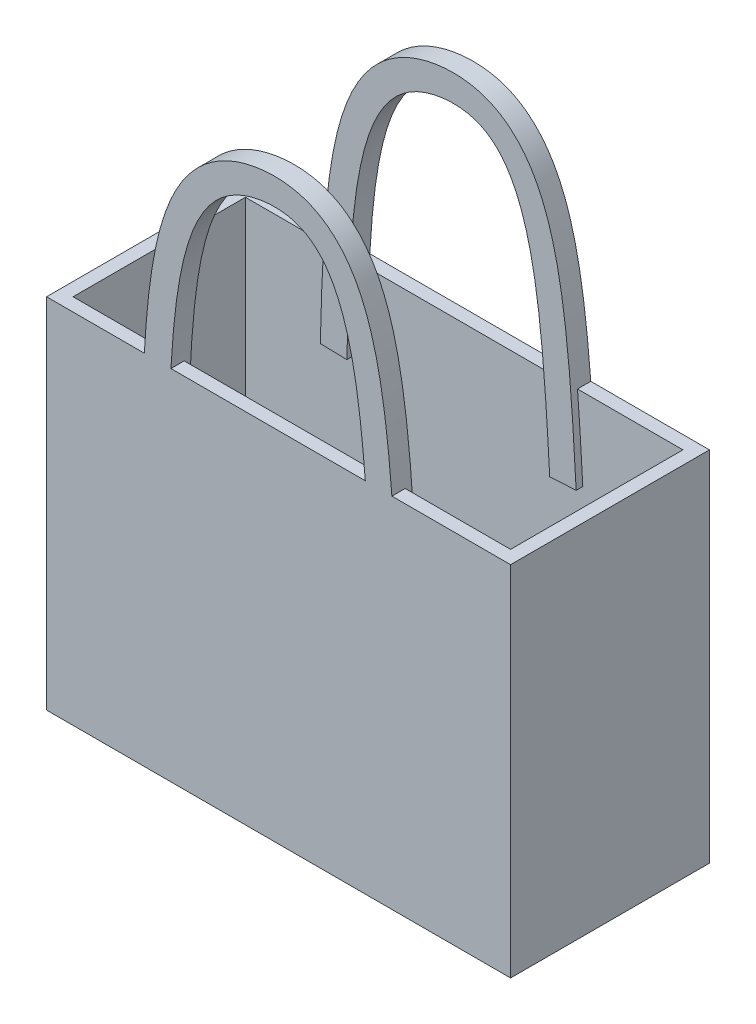
ISO-10303-21;
HEADER;
FILE_DESCRIPTION(('STEP AP214'),'2;1');
FILE_NAME('part.step','',(''),(''),'','','');
FILE_SCHEMA(('AUTOMOTIVE_DESIGN { 1 0 10303 214 1 1 1 1 }'));
ENDSEC;
DATA;
#1=APPLICATION_CONTEXT('core data for automotive mechanical design processes');
#2=APPLICATION_PROTOCOL_DEFINITION('international standard','automotive_design',2000,#1);
#3=PRODUCT_CONTEXT('',#1,'mechanical');
#4=PRODUCT('Part','Part','',(#3));
#5=PRODUCT_RELATED_PRODUCT_CATEGORY('part','',(#4));
#6=PRODUCT_DEFINITION_FORMATION('','',#4);
#7=PRODUCT_DEFINITION_CONTEXT('part definition',#1,'design');
#8=PRODUCT_DEFINITION('design','',#6,#7);
#9=PRODUCT_DEFINITION_SHAPE('','',#8);
#10=(LENGTH_UNIT() NAMED_UNIT(*) SI_UNIT(.MILLI.,.METRE.));
#11=(NAMED_UNIT(*) PLANE_ANGLE_UNIT() SI_UNIT($,.RADIAN.));
#12=(NAMED_UNIT(*) SI_UNIT($,.STERADIAN.) SOLID_ANGLE_UNIT());
#13=UNCERTAINTY_MEASURE_WITH_UNIT(LENGTH_MEASURE(1.E-05),#10,'distance_accuracy_value','');
#14=(GEOMETRIC_REPRESENTATION_CONTEXT(3) GLOBAL_UNCERTAINTY_ASSIGNED_CONTEXT((#13)) GLOBAL_UNIT_ASSIGNED_CONTEXT((#10,
#11,#12)) REPRESENTATION_CONTEXT('',''));
#15=CARTESIAN_POINT('',(0.,0.,0.));
#16=DIRECTION('',(0.,0.,1.));
#17=DIRECTION('',(1.,0.,0.));
#18=AXIS2_PLACEMENT_3D('',#15,#16,#17);
#19=CARTESIAN_POINT('',(0.,0.,150.));
#20=DIRECTION('',(0.,-1.,0.));
#21=DIRECTION('',(0.,0.,-1.));
#22=AXIS2_PLACEMENT_3D('',#19,#20,#21);
#23=PLANE('',#22);
#24=DIRECTION('',(0.,0.,-1.));
#25=VECTOR('',#24,1.);
#26=CARTESIAN_POINT('',(93.794809096541,0.,15.));
#27=LINE('',#26,#25);
#28=CARTESIAN_POINT('',(93.7948090965409,0.,10.));
#29=VERTEX_POINT('',#28);
#30=CARTESIAN_POINT('',(93.7948090965409,0.,0.));
#31=VERTEX_POINT('',#30);
#32=EDGE_CURVE('E285',#29,#31,#27,.T.);
#33=ORIENTED_EDGE('',*,*,#32,.F.);
#34=DIRECTION('',(-1.,0.,0.));
#35=VECTOR('',#34,1.);
#36=CARTESIAN_POINT('',(10.,0.,10.));
#37=LINE('',#36,#35);
#38=CARTESIAN_POINT('',(240.414570299536,0.,10.));
#39=VERTEX_POINT('',#38);
#40=EDGE_CURVE('E338',#39,#29,#37,.T.);
#41=ORIENTED_EDGE('',*,*,#40,.F.);
#42=DIRECTION('',(0.,0.,-1.));
#43=VECTOR('',#42,1.);
#44=CARTESIAN_POINT('',(240.414570299536,0.,15.));
#45=LINE('',#44,#43);
#46=CARTESIAN_POINT('',(240.414570299536,0.,0.));
#47=VERTEX_POINT('',#46);
#48=EDGE_CURVE('E444',#47,#39,#45,.F.);
#49=ORIENTED_EDGE('',*,*,#48,.F.);
#50=DIRECTION('',(-1.,0.,0.));
#51=VECTOR('',#50,1.);
#52=CARTESIAN_POINT('',(0.,0.,0.));
#53=LINE('',#52,#51);
#54=EDGE_CURVE('E65',#47,#31,#53,.T.);
#55=ORIENTED_EDGE('',*,*,#54,.T.);
#56=EDGE_LOOP('',(#33,#41,#49,#55));
#57=FACE_BOUND('',#56,.T.);
#58=ADVANCED_FACE('F41',(#57),#23,.F.);
#59=DIRECTION('',(0.,0.,-1.));
#60=VECTOR('',#59,1.);
#61=CARTESIAN_POINT('',(260.479594823145,0.,15.));
#62=LINE('',#61,#60);
#63=CARTESIAN_POINT('',(260.479594822731,5.16859818833204E-09,10.));
#64=VERTEX_POINT('',#63);
#65=CARTESIAN_POINT('',(260.479594822731,0.,0.));
#66=VERTEX_POINT('',#65);
#67=EDGE_CURVE('E442',#64,#66,#62,.T.);
#68=ORIENTED_EDGE('',*,*,#67,.F.);
#69=CARTESIAN_POINT('',(340.,0.,10.));
#70=VERTEX_POINT('',#69);
#71=EDGE_CURVE('E335',#70,#64,#37,.T.);
#72=ORIENTED_EDGE('',*,*,#71,.F.);
#73=DIRECTION('',(0.,0.,-1.));
#74=VECTOR('',#73,1.);
#75=CARTESIAN_POINT('',(340.,0.,10.));
#76=LINE('',#75,#74);
#77=CARTESIAN_POINT('',(340.,0.,140.));
#78=VERTEX_POINT('',#77);
#79=EDGE_CURVE('E318',#78,#70,#76,.T.);
#80=ORIENTED_EDGE('',*,*,#79,.F.);
#81=DIRECTION('',(1.,0.,0.));
#82=VECTOR('',#81,1.);
#83=CARTESIAN_POINT('',(10.,0.,140.));
#84=LINE('',#83,#82);
#85=CARTESIAN_POINT('',(260.479594822731,5.16859818833204E-09,140.));
#86=VERTEX_POINT('',#85);
#87=EDGE_CURVE('E341',#86,#78,#84,.T.);
#88=ORIENTED_EDGE('',*,*,#87,.F.);
#89=DIRECTION('',(0.,0.,1.));
#90=VECTOR('',#89,1.);
#91=CARTESIAN_POINT('',(260.479594823145,0.,135.));
#92=LINE('',#91,#90);
#93=CARTESIAN_POINT('',(260.479594822731,5.16843946113399E-09,150.));
#94=VERTEX_POINT('',#93);
#95=EDGE_CURVE('E309',#86,#94,#92,.T.);
#96=ORIENTED_EDGE('',*,*,#95,.T.);
#97=DIRECTION('',(-1.,0.,0.));
#98=VECTOR('',#97,1.);
#99=CARTESIAN_POINT('',(0.,0.,150.));
#100=LINE('',#99,#98);
#101=CARTESIAN_POINT('',(350.,0.,150.));
#102=VERTEX_POINT('',#101);
#103=EDGE_CURVE('E365',#102,#94,#100,.T.);
#104=ORIENTED_EDGE('',*,*,#103,.F.);
#105=DIRECTION('',(0.,0.,-1.));
#106=VECTOR('',#105,1.);
#107=CARTESIAN_POINT('',(350.,0.,150.));
#108=LINE('',#107,#106);
#109=CARTESIAN_POINT('',(350.,0.,0.));
#110=VERTEX_POINT('',#109);
#111=EDGE_CURVE('E380',#102,#110,#108,.T.);
#112=ORIENTED_EDGE('',*,*,#111,.T.);
#113=EDGE_CURVE('E360',#110,#66,#53,.T.);
#114=ORIENTED_EDGE('',*,*,#113,.T.);
#115=EDGE_LOOP('',(#68,#72,#80,#88,#96,#104,#112,#114));
#116=FACE_BOUND('',#115,.T.);
#117=ADVANCED_FACE('F489',(#116),#23,.F.);
#118=DIRECTION('',(0.,0.,-1.));
#119=VECTOR('',#118,1.);
#120=CARTESIAN_POINT('',(73.7625136466976,0.,15.));
#121=LINE('',#120,#119);
#122=CARTESIAN_POINT('',(73.7625136466978,0.,0.));
#123=VERTEX_POINT('',#122);
#124=CARTESIAN_POINT('',(73.7625136466978,0.,10.));
#125=VERTEX_POINT('',#124);
#126=EDGE_CURVE('E57',#123,#125,#121,.F.);
#127=ORIENTED_EDGE('',*,*,#126,.F.);
#128=CARTESIAN_POINT('',(0.,0.,0.));
#129=VERTEX_POINT('',#128);
#130=EDGE_CURVE('E376',#123,#129,#53,.T.);
#131=ORIENTED_EDGE('',*,*,#130,.T.);
#132=DIRECTION('',(0.,0.,-1.));
#133=VECTOR('',#132,1.);
#134=CARTESIAN_POINT('',(0.,0.,150.));
#135=LINE('',#134,#133);
#136=CARTESIAN_POINT('',(0.,0.,150.));
#137=VERTEX_POINT('',#136);
#138=EDGE_CURVE('E368',#137,#129,#135,.T.);
#139=ORIENTED_EDGE('',*,*,#138,.F.);
#140=CARTESIAN_POINT('',(73.7625136466978,3.05723328597463E-12,150.));
#141=VERTEX_POINT('',#140);
#142=EDGE_CURVE('E364',#141,#137,#100,.T.);
#143=ORIENTED_EDGE('',*,*,#142,.F.);
#144=DIRECTION('',(0.,0.,1.));
#145=VECTOR('',#144,1.);
#146=CARTESIAN_POINT('',(73.7625136466976,0.,135.));
#147=LINE('',#146,#145);
#148=CARTESIAN_POINT('',(73.7625136466978,3.05723328597463E-12,140.));
#149=VERTEX_POINT('',#148);
#150=EDGE_CURVE('E300',#141,#149,#147,.F.);
#151=ORIENTED_EDGE('',*,*,#150,.T.);
#152=CARTESIAN_POINT('',(10.,0.,140.));
#153=VERTEX_POINT('',#152);
#154=EDGE_CURVE('E323',#153,#149,#84,.T.);
#155=ORIENTED_EDGE('',*,*,#154,.F.);
#156=DIRECTION('',(0.,0.,1.));
#157=VECTOR('',#156,1.);
#158=CARTESIAN_POINT('',(10.,0.,10.));
#159=LINE('',#158,#157);
#160=CARTESIAN_POINT('',(10.,0.,10.));
#161=VERTEX_POINT('',#160);
#162=EDGE_CURVE('E337',#161,#153,#159,.T.);
#163=ORIENTED_EDGE('',*,*,#162,.F.);
#164=EDGE_CURVE('E334',#125,#161,#37,.T.);
#165=ORIENTED_EDGE('',*,*,#164,.F.);
#166=EDGE_LOOP('',(#127,#131,#139,#143,#151,#155,#163,#165));
#167=FACE_BOUND('',#166,.T.);
#168=ADVANCED_FACE('F474',(#167),#23,.F.);
#169=CARTESIAN_POINT('',(10.,-231.,10.));
#170=DIRECTION('',(0.,0.,-1.));
#171=DIRECTION('',(-1.,0.,0.));
#172=AXIS2_PLACEMENT_3D('',#169,#170,#171);
#173=PLANE('',#172);
#174=CARTESIAN_POINT('',(91.4929809096213,-62.8156278497075,10.));
#175=CARTESIAN_POINT('',(94.1433152416058,44.5229125956667,10.));
#176=CARTESIAN_POINT('',(99.6512458376963,140.581809831668,10.));
#177=CARTESIAN_POINT('',(229.93611277386,149.87502618412,10.));
#178=CARTESIAN_POINT('',(238.321506577675,48.0566833183809,10.));
#179=CARTESIAN_POINT('',(244.505619551194,-62.8156278497071,10.));
#180=B_SPLINE_CURVE_WITH_KNOTS('',3,(#174,#175,#176,#177,#178,#179),.UNSPECIFIED.,.F.,.F.,(4,1,
1,4),(0.,0.479711783292934,0.579711783292933,1.),.UNSPECIFIED.);
#181=CARTESIAN_POINT('',(244.505619551194,-62.8156278497071,10.));
#182=VERTEX_POINT('',#181);
#183=EDGE_CURVE('E11',#39,#182,#180,.T.);
#184=ORIENTED_EDGE('',*,*,#183,.F.);
#185=ORIENTED_EDGE('',*,*,#40,.T.);
#186=CARTESIAN_POINT('',(91.4929809096213,-62.8156278497071,10.));
#187=VERTEX_POINT('',#186);
#188=EDGE_CURVE('E50',#187,#29,#180,.T.);
#189=ORIENTED_EDGE('',*,*,#188,.F.);
#190=DIRECTION('',(0.999695307732111,-0.0246838347587989,0.));
#191=VECTOR('',#190,1.);
#192=CARTESIAN_POINT('',(14.1998233376946,-60.9071548232412,10.));
#193=LINE('',#192,#191);
#194=CARTESIAN_POINT('',(71.499074754979,-62.3219511545311,10.));
#195=VERTEX_POINT('',#194);
#196=EDGE_CURVE('E220',#195,#187,#193,.T.);
#197=ORIENTED_EDGE('',*,*,#196,.F.);
#198=CARTESIAN_POINT('',(264.474581336507,-61.7018212162633,10.));
#199=CARTESIAN_POINT('',(264.359861197015,-59.6450530010714,10.));
#200=CARTESIAN_POINT('',(264.1281711613,-55.5183281460358,10.));
#201=CARTESIAN_POINT('',(263.662584547036,-47.3715169307364,10.));
#202=CARTESIAN_POINT('',(263.068669824457,-37.3189162788222,10.));
#203=CARTESIAN_POINT('',(262.32607309182,-25.4989973807097,10.));
#204=CARTESIAN_POINT('',(261.279307032465,-10.0695009524096,10.));
#205=CARTESIAN_POINT('',(259.834076027679,8.56805980484624,10.));
#206=CARTESIAN_POINT('',(257.77886641607,29.8174841784501,10.));
#207=CARTESIAN_POINT('',(255.296076431386,49.8816023376985,10.));
#208=CARTESIAN_POINT('',(251.253957388999,74.9779877582421,10.));
#209=CARTESIAN_POINT('',(245.870456485047,97.5002400792132,10.));
#210=CARTESIAN_POINT('',(238.370187441123,117.374287672239,10.));
#211=CARTESIAN_POINT('',(231.363192359434,130.930109167378,10.));
#212=CARTESIAN_POINT('',(222.563205850644,142.999320369824,10.));
#213=CARTESIAN_POINT('',(211.52124285423,153.16424797389,10.));
#214=CARTESIAN_POINT('',(200.41860218203,159.355264747324,10.));
#215=CARTESIAN_POINT('',(190.636952866794,162.586657437858,10.));
#216=CARTESIAN_POINT('',(183.158869733971,164.088930655825,10.));
#217=CARTESIAN_POINT('',(175.715503482644,164.788484604246,10.));
#218=CARTESIAN_POINT('',(165.858150685831,164.786603224791,10.));
#219=CARTESIAN_POINT('',(153.792320603951,163.213522240861,10.));
#220=CARTESIAN_POINT('',(140.018348362321,159.056690804969,10.));
#221=CARTESIAN_POINT('',(127.488531798112,152.64833779447,10.));
#222=CARTESIAN_POINT('',(116.504391157525,144.203146271106,10.));
#223=CARTESIAN_POINT('',(104.117409689732,130.714428633952,10.));
#224=CARTESIAN_POINT('',(92.7078956653951,110.654723234851,10.));
#225=CARTESIAN_POINT('',(83.7589594824481,82.8739265829659,10.));
#226=CARTESIAN_POINT('',(78.991737002638,56.781257619985,10.));
#227=CARTESIAN_POINT('',(76.3073193709062,34.202145736461,10.));
#228=CARTESIAN_POINT('',(74.7610979260472,16.4395281432733,10.));
#229=CARTESIAN_POINT('',(73.5900141298827,-2.1217321966958,10.));
#230=CARTESIAN_POINT('',(72.8556330828585,-18.2249979813567,10.));
#231=CARTESIAN_POINT('',(72.3721091210352,-31.4691073144518,10.));
#232=CARTESIAN_POINT('',(72.0515239720081,-41.576380623869,10.));
#233=CARTESIAN_POINT('',(71.8110855051603,-50.1432771889315,10.));
#234=CARTESIAN_POINT('',(71.6300816115548,-57.0720872412288,10.));
#235=CARTESIAN_POINT('',(71.5422043248216,-60.5752035759095,10.));
#236=CARTESIAN_POINT('',(71.499074754979,-62.3219511545311,10.));
#237=B_SPLINE_CURVE_WITH_KNOTS('',3,(#198,#199,#200,#201,#202,#203,#204,#205,#206,#207,#208,
#209,#210,#211,#212,#213,#214,#215,#216,#217,#218,#219,#220,#221,#222,#223,#224,#225,#226,#227,
#228,#229,#230,#231,#232,#233,#234,#235,#236),.UNSPECIFIED.,.F.,.F.,(4,1,1,1,1,1,1,1,1,1,1,1,1,
1,1,1,1,1,1,1,1,1,1,1,1,1,1,1,1,1,1,1,1,1,1,1,4),(0.,0.0078125,0.015625,0.03125,0.046875,0.0625,
0.09375,0.125,0.15625,0.1875,0.25,0.28125,0.3125,0.34375,0.375,0.40625,0.421875,0.4375,0.453125,
0.46875,0.5,0.53125,0.5625,0.59375,0.625,0.6875,0.75,0.8125,0.84375,0.875,0.90625,0.9375,
0.953125,0.96875,0.984375,0.9921875,1.),.UNSPECIFIED.);
#238=EDGE_CURVE('E414',#125,#195,#237,.T.);
#239=ORIENTED_EDGE('',*,*,#238,.F.);
#240=ORIENTED_EDGE('',*,*,#164,.T.);
#241=DIRECTION('',(0.,1.,0.));
#242=VECTOR('',#241,1.);
#243=CARTESIAN_POINT('',(10.,-231.,10.));
#244=LINE('',#243,#242);
#245=CARTESIAN_POINT('',(10.,-231.,10.));
#246=VERTEX_POINT('',#245);
#247=EDGE_CURVE('E351',#246,#161,#244,.T.);
#248=ORIENTED_EDGE('',*,*,#247,.F.);
#249=DIRECTION('',(-1.,0.,0.));
#250=VECTOR('',#249,1.);
#251=CARTESIAN_POINT('',(10.,-231.,10.));
#252=LINE('',#251,#250);
#253=CARTESIAN_POINT('',(340.,-231.,10.));
#254=VERTEX_POINT('',#253);
#255=EDGE_CURVE('E322',#254,#246,#252,.T.);
#256=ORIENTED_EDGE('',*,*,#255,.F.);
#257=DIRECTION('',(0.,1.,0.));
#258=VECTOR('',#257,1.);
#259=CARTESIAN_POINT('',(340.,-231.,10.));
#260=LINE('',#259,#258);
#261=EDGE_CURVE('E332',#254,#70,#260,.T.);
#262=ORIENTED_EDGE('',*,*,#261,.T.);
#263=ORIENTED_EDGE('',*,*,#71,.T.);
#264=CARTESIAN_POINT('',(264.474581336507,-61.7018212162633,10.));
#265=VERTEX_POINT('',#264);
#266=EDGE_CURVE('E418',#265,#64,#237,.T.);
#267=ORIENTED_EDGE('',*,*,#266,.F.);
#268=DIRECTION('',(0.998448089265657,0.0556903316721882,0.));
#269=VECTOR('',#268,1.);
#270=CARTESIAN_POINT('',(1.37559089349026,-76.3766653047185,10.));
#271=LINE('',#270,#269);
#272=EDGE_CURVE('E45',#182,#265,#271,.T.);
#273=ORIENTED_EDGE('',*,*,#272,.F.);
#274=EDGE_LOOP('',(#184,#185,#189,#197,#239,#240,#248,#256,#262,#263,#267,#273));
#275=FACE_BOUND('',#274,.T.);
#276=ADVANCED_FACE('F470',(#275),#173,.F.);
#277=CARTESIAN_POINT('',(93.7948090965409,-1.64278313175004E-12,140.));
#278=VERTEX_POINT('',#277);
#279=CARTESIAN_POINT('',(240.414570299536,-2.85188539450587E-12,140.));
#280=VERTEX_POINT('',#279);
#281=EDGE_CURVE('E344',#278,#280,#84,.T.);
#282=ORIENTED_EDGE('',*,*,#281,.F.);
#283=DIRECTION('',(0.,0.,1.));
#284=VECTOR('',#283,1.);
#285=CARTESIAN_POINT('',(93.794809096541,0.,135.));
#286=LINE('',#285,#284);
#287=CARTESIAN_POINT('',(93.7948090965409,-1.70002900645727E-12,150.));
#288=VERTEX_POINT('',#287);
#289=EDGE_CURVE('E315',#278,#288,#286,.T.);
#290=ORIENTED_EDGE('',*,*,#289,.T.);
#291=CARTESIAN_POINT('',(240.414570299536,-3.45903861109775E-12,150.));
#292=VERTEX_POINT('',#291);
#293=EDGE_CURVE('E369',#292,#288,#100,.T.);
#294=ORIENTED_EDGE('',*,*,#293,.F.);
#295=DIRECTION('',(0.,0.,1.));
#296=VECTOR('',#295,1.);
#297=CARTESIAN_POINT('',(240.414570299536,0.,135.));
#298=LINE('',#297,#296);
#299=EDGE_CURVE('E312',#292,#280,#298,.F.);
#300=ORIENTED_EDGE('',*,*,#299,.T.);
#301=EDGE_LOOP('',(#282,#290,#294,#300));
#302=FACE_BOUND('',#301,.T.);
#303=ADVANCED_FACE('F473',(#302),#23,.F.);
#304=CARTESIAN_POINT('',(0.,0.,150.));
#305=DIRECTION('',(1.,0.,0.));
#306=DIRECTION('',(0.,1.,0.));
#307=AXIS2_PLACEMENT_3D('',#304,#305,#306);
#308=PLANE('',#307);
#309=DIRECTION('',(0.,-1.,0.));
#310=VECTOR('',#309,1.);
#311=CARTESIAN_POINT('',(0.,0.,0.));
#312=LINE('',#311,#310);
#313=CARTESIAN_POINT('',(0.,-270.,0.));
#314=VERTEX_POINT('',#313);
#315=EDGE_CURVE('E348',#129,#314,#312,.T.);
#316=ORIENTED_EDGE('',*,*,#315,.T.);
#317=DIRECTION('',(0.,0.,-1.));
#318=VECTOR('',#317,1.);
#319=CARTESIAN_POINT('',(0.,-270.,150.));
#320=LINE('',#319,#318);
#321=CARTESIAN_POINT('',(0.,-270.,150.));
#322=VERTEX_POINT('',#321);
#323=EDGE_CURVE('E386',#322,#314,#320,.T.);
#324=ORIENTED_EDGE('',*,*,#323,.F.);
#325=DIRECTION('',(0.,-1.,0.));
#326=VECTOR('',#325,1.);
#327=CARTESIAN_POINT('',(0.,0.,150.));
#328=LINE('',#327,#326);
#329=EDGE_CURVE('E356',#137,#322,#328,.T.);
#330=ORIENTED_EDGE('',*,*,#329,.F.);
#331=ORIENTED_EDGE('',*,*,#138,.T.);
#332=EDGE_LOOP('',(#316,#324,#330,#331));
#333=FACE_BOUND('',#332,.T.);
#334=ADVANCED_FACE('F43',(#333),#308,.F.);
#335=CARTESIAN_POINT('',(0.,-270.,150.));
#336=DIRECTION('',(0.,1.,0.));
#337=DIRECTION('',(0.,0.,1.));
#338=AXIS2_PLACEMENT_3D('',#335,#336,#337);
#339=PLANE('',#338);
#340=DIRECTION('',(1.,0.,0.));
#341=VECTOR('',#340,1.);
#342=CARTESIAN_POINT('',(0.,-270.,0.));
#343=LINE('',#342,#341);
#344=CARTESIAN_POINT('',(350.,-270.,0.));
#345=VERTEX_POINT('',#344);
#346=EDGE_CURVE('E372',#314,#345,#343,.T.);
#347=ORIENTED_EDGE('',*,*,#346,.T.);
#348=DIRECTION('',(0.,0.,-1.));
#349=VECTOR('',#348,1.);
#350=CARTESIAN_POINT('',(350.,-270.,150.));
#351=LINE('',#350,#349);
#352=CARTESIAN_POINT('',(350.,-270.,150.));
#353=VERTEX_POINT('',#352);
#354=EDGE_CURVE('E383',#353,#345,#351,.T.);
#355=ORIENTED_EDGE('',*,*,#354,.F.);
#356=DIRECTION('',(1.,0.,0.));
#357=VECTOR('',#356,1.);
#358=CARTESIAN_POINT('',(0.,-270.,150.));
#359=LINE('',#358,#357);
#360=EDGE_CURVE('E359',#322,#353,#359,.T.);
#361=ORIENTED_EDGE('',*,*,#360,.F.);
#362=ORIENTED_EDGE('',*,*,#323,.T.);
#363=EDGE_LOOP('',(#347,#355,#361,#362));
#364=FACE_BOUND('',#363,.T.);
#365=ADVANCED_FACE('F491',(#364),#339,.F.);
#366=CARTESIAN_POINT('',(350.,0.,150.));
#367=DIRECTION('',(-1.,0.,0.));
#368=DIRECTION('',(0.,-1.,0.));
#369=AXIS2_PLACEMENT_3D('',#366,#367,#368);
#370=PLANE('',#369);
#371=DIRECTION('',(0.,1.,0.));
#372=VECTOR('',#371,1.);
#373=CARTESIAN_POINT('',(350.,0.,0.));
#374=LINE('',#373,#372);
#375=EDGE_CURVE('E374',#345,#110,#374,.T.);
#376=ORIENTED_EDGE('',*,*,#375,.T.);
#377=ORIENTED_EDGE('',*,*,#111,.F.);
#378=DIRECTION('',(0.,1.,0.));
#379=VECTOR('',#378,1.);
#380=CARTESIAN_POINT('',(350.,0.,150.));
#381=LINE('',#380,#379);
#382=EDGE_CURVE('E362',#353,#102,#381,.T.);
#383=ORIENTED_EDGE('',*,*,#382,.F.);
#384=ORIENTED_EDGE('',*,*,#354,.T.);
#385=EDGE_LOOP('',(#376,#377,#383,#384));
#386=FACE_BOUND('',#385,.T.);
#387=ADVANCED_FACE('F482',(#386),#370,.F.);
#388=CARTESIAN_POINT('',(0.,0.,150.));
#389=DIRECTION('',(0.,0.,1.));
#390=DIRECTION('',(1.,0.,0.));
#391=AXIS2_PLACEMENT_3D('',#388,#389,#390);
#392=PLANE('',#391);
#393=CARTESIAN_POINT('',(264.474581336507,-61.7018212162633,150.));
#394=CARTESIAN_POINT('',(264.359861197015,-59.6450530010714,150.));
#395=CARTESIAN_POINT('',(264.1281711613,-55.5183281460358,150.));
#396=CARTESIAN_POINT('',(263.662584547036,-47.3715169307364,150.));
#397=CARTESIAN_POINT('',(263.068669824457,-37.3189162788222,150.));
#398=CARTESIAN_POINT('',(262.32607309182,-25.4989973807097,150.));
#399=CARTESIAN_POINT('',(261.279307032465,-10.0695009524096,150.));
#400=CARTESIAN_POINT('',(259.834076027679,8.56805980484624,150.));
#401=CARTESIAN_POINT('',(257.77886641607,29.8174841784501,150.));
#402=CARTESIAN_POINT('',(255.296076431386,49.8816023376985,150.));
#403=CARTESIAN_POINT('',(251.253957388999,74.9779877582421,150.));
#404=CARTESIAN_POINT('',(245.870456485047,97.5002400792132,150.));
#405=CARTESIAN_POINT('',(238.370187441123,117.374287672239,150.));
#406=CARTESIAN_POINT('',(231.363192359434,130.930109167378,150.));
#407=CARTESIAN_POINT('',(222.563205850644,142.999320369824,150.));
#408=CARTESIAN_POINT('',(211.52124285423,153.16424797389,150.));
#409=CARTESIAN_POINT('',(200.41860218203,159.355264747324,150.));
#410=CARTESIAN_POINT('',(190.636952866794,162.586657437858,150.));
#411=CARTESIAN_POINT('',(183.158869733971,164.088930655825,150.));
#412=CARTESIAN_POINT('',(175.715503482644,164.788484604246,150.));
#413=CARTESIAN_POINT('',(165.858150685831,164.786603224791,150.));
#414=CARTESIAN_POINT('',(153.792320603951,163.213522240861,150.));
#415=CARTESIAN_POINT('',(140.018348362321,159.056690804969,150.));
#416=CARTESIAN_POINT('',(127.488531798112,152.64833779447,150.));
#417=CARTESIAN_POINT('',(116.504391157525,144.203146271106,150.));
#418=CARTESIAN_POINT('',(104.117409689732,130.714428633952,150.));
#419=CARTESIAN_POINT('',(92.7078956653951,110.654723234851,150.));
#420=CARTESIAN_POINT('',(83.7589594824481,82.8739265829659,150.));
#421=CARTESIAN_POINT('',(78.991737002638,56.781257619985,150.));
#422=CARTESIAN_POINT('',(76.3073193709062,34.202145736461,150.));
#423=CARTESIAN_POINT('',(74.7610979260472,16.4395281432733,150.));
#424=CARTESIAN_POINT('',(73.5900141298827,-2.1217321966958,150.));
#425=CARTESIAN_POINT('',(72.8556330828585,-18.2249979813567,150.));
#426=CARTESIAN_POINT('',(72.3721091210352,-31.4691073144518,150.));
#427=CARTESIAN_POINT('',(72.0515239720081,-41.576380623869,150.));
#428=CARTESIAN_POINT('',(71.8110855051603,-50.1432771889315,150.));
#429=CARTESIAN_POINT('',(71.6300816115548,-57.0720872412288,150.));
#430=CARTESIAN_POINT('',(71.5422043248216,-60.5752035759095,150.));
#431=CARTESIAN_POINT('',(71.499074754979,-62.3219511545311,150.));
#432=B_SPLINE_CURVE_WITH_KNOTS('',3,(#393,#394,#395,#396,#397,#398,#399,#400,#401,#402,#403,
#404,#405,#406,#407,#408,#409,#410,#411,#412,#413,#414,#415,#416,#417,#418,#419,#420,#421,#422,
#423,#424,#425,#426,#427,#428,#429,#430,#431),.UNSPECIFIED.,.F.,.F.,(4,1,1,1,1,1,1,1,1,1,1,1,1,
1,1,1,1,1,1,1,1,1,1,1,1,1,1,1,1,1,1,1,1,1,1,1,4),(0.,0.0078125,0.015625,0.03125,0.046875,0.0625,
0.09375,0.125,0.15625,0.1875,0.25,0.28125,0.3125,0.34375,0.375,0.40625,0.421875,0.4375,0.453125,
0.46875,0.5,0.53125,0.5625,0.59375,0.625,0.6875,0.75,0.8125,0.84375,0.875,0.90625,0.9375,
0.953125,0.96875,0.984375,0.9921875,1.),.UNSPECIFIED.);
#433=EDGE_CURVE('E284',#94,#141,#432,.T.);
#434=ORIENTED_EDGE('',*,*,#433,.T.);
#435=ORIENTED_EDGE('',*,*,#142,.T.);
#436=ORIENTED_EDGE('',*,*,#329,.T.);
#437=ORIENTED_EDGE('',*,*,#360,.T.);
#438=ORIENTED_EDGE('',*,*,#382,.T.);
#439=ORIENTED_EDGE('',*,*,#103,.T.);
#440=EDGE_LOOP('',(#434,#435,#436,#437,#438,#439));
#441=FACE_BOUND('',#440,.T.);
#442=ORIENTED_EDGE('',*,*,#293,.T.);
#443=CARTESIAN_POINT('',(91.4929809096213,-62.8156278497075,150.));
#444=CARTESIAN_POINT('',(94.1433152416058,44.5229125956667,150.));
#445=CARTESIAN_POINT('',(99.6512458376963,140.581809831668,150.));
#446=CARTESIAN_POINT('',(229.93611277386,149.87502618412,150.));
#447=CARTESIAN_POINT('',(238.321506577675,48.0566833183809,150.));
#448=CARTESIAN_POINT('',(244.505619551194,-62.8156278497071,150.));
#449=B_SPLINE_CURVE_WITH_KNOTS('',3,(#443,#444,#445,#446,#447,#448),.UNSPECIFIED.,.F.,.F.,(4,1,
1,4),(0.,0.479711783292934,0.579711783292933,1.),.UNSPECIFIED.);
#450=EDGE_CURVE('E279',#288,#292,#449,.T.);
#451=ORIENTED_EDGE('',*,*,#450,.T.);
#452=EDGE_LOOP('',(#442,#451));
#453=FACE_BOUND('',#452,.T.);
#454=ADVANCED_FACE('F479',(#441,#453),#392,.T.);
#455=CARTESIAN_POINT('',(0.,0.,0.));
#456=DIRECTION('',(0.,0.,1.));
#457=DIRECTION('',(1.,0.,0.));
#458=AXIS2_PLACEMENT_3D('',#455,#456,#457);
#459=PLANE('',#458);
#460=ORIENTED_EDGE('',*,*,#54,.F.);
#461=CARTESIAN_POINT('',(91.4929809096213,-62.8156278497075,0.));
#462=CARTESIAN_POINT('',(94.1433152416058,44.5229125956667,0.));
#463=CARTESIAN_POINT('',(99.6512458376963,140.581809831668,0.));
#464=CARTESIAN_POINT('',(229.93611277386,149.87502618412,0.));
#465=CARTESIAN_POINT('',(238.321506577675,48.0566833183809,0.));
#466=CARTESIAN_POINT('',(244.505619551194,-62.8156278497071,0.));
#467=B_SPLINE_CURVE_WITH_KNOTS('',3,(#461,#462,#463,#464,#465,#466),.UNSPECIFIED.,.F.,.F.,(4,1,
1,4),(0.,0.479711783292934,0.579711783292933,1.),.UNSPECIFIED.);
#468=EDGE_CURVE('E232',#31,#47,#467,.T.);
#469=ORIENTED_EDGE('',*,*,#468,.F.);
#470=EDGE_LOOP('',(#460,#469));
#471=FACE_BOUND('',#470,.T.);
#472=CARTESIAN_POINT('',(264.474581336507,-61.7018212162633,0.));
#473=CARTESIAN_POINT('',(264.359861197015,-59.6450530010714,0.));
#474=CARTESIAN_POINT('',(264.1281711613,-55.5183281460358,0.));
#475=CARTESIAN_POINT('',(263.662584547036,-47.3715169307364,0.));
#476=CARTESIAN_POINT('',(263.068669824457,-37.3189162788222,0.));
#477=CARTESIAN_POINT('',(262.32607309182,-25.4989973807097,0.));
#478=CARTESIAN_POINT('',(261.279307032465,-10.0695009524096,0.));
#479=CARTESIAN_POINT('',(259.834076027679,8.56805980484624,0.));
#480=CARTESIAN_POINT('',(257.77886641607,29.8174841784501,0.));
#481=CARTESIAN_POINT('',(255.296076431386,49.8816023376985,0.));
#482=CARTESIAN_POINT('',(251.253957388999,74.9779877582421,0.));
#483=CARTESIAN_POINT('',(245.870456485047,97.5002400792132,0.));
#484=CARTESIAN_POINT('',(238.370187441123,117.374287672239,0.));
#485=CARTESIAN_POINT('',(231.363192359434,130.930109167378,0.));
#486=CARTESIAN_POINT('',(222.563205850644,142.999320369824,0.));
#487=CARTESIAN_POINT('',(211.52124285423,153.16424797389,0.));
#488=CARTESIAN_POINT('',(200.41860218203,159.355264747324,0.));
#489=CARTESIAN_POINT('',(190.636952866794,162.586657437858,0.));
#490=CARTESIAN_POINT('',(183.158869733971,164.088930655825,0.));
#491=CARTESIAN_POINT('',(175.715503482644,164.788484604246,0.));
#492=CARTESIAN_POINT('',(165.858150685831,164.786603224791,0.));
#493=CARTESIAN_POINT('',(153.792320603951,163.213522240861,0.));
#494=CARTESIAN_POINT('',(140.018348362321,159.056690804969,0.));
#495=CARTESIAN_POINT('',(127.488531798112,152.64833779447,0.));
#496=CARTESIAN_POINT('',(116.504391157525,144.203146271106,0.));
#497=CARTESIAN_POINT('',(104.117409689732,130.714428633952,0.));
#498=CARTESIAN_POINT('',(92.7078956653951,110.654723234851,0.));
#499=CARTESIAN_POINT('',(83.7589594824481,82.8739265829659,0.));
#500=CARTESIAN_POINT('',(78.991737002638,56.781257619985,0.));
#501=CARTESIAN_POINT('',(76.3073193709062,34.202145736461,0.));
#502=CARTESIAN_POINT('',(74.7610979260472,16.4395281432733,0.));
#503=CARTESIAN_POINT('',(73.5900141298827,-2.1217321966958,0.));
#504=CARTESIAN_POINT('',(72.8556330828585,-18.2249979813567,0.));
#505=CARTESIAN_POINT('',(72.3721091210352,-31.4691073144518,0.));
#506=CARTESIAN_POINT('',(72.0515239720081,-41.576380623869,0.));
#507=CARTESIAN_POINT('',(71.8110855051603,-50.1432771889315,0.));
#508=CARTESIAN_POINT('',(71.6300816115548,-57.0720872412288,0.));
#509=CARTESIAN_POINT('',(71.5422043248216,-60.5752035759095,0.));
#510=CARTESIAN_POINT('',(71.499074754979,-62.3219511545311,0.));
#511=B_SPLINE_CURVE_WITH_KNOTS('',3,(#472,#473,#474,#475,#476,#477,#478,#479,#480,#481,#482,
#483,#484,#485,#486,#487,#488,#489,#490,#491,#492,#493,#494,#495,#496,#497,#498,#499,#500,#501,
#502,#503,#504,#505,#506,#507,#508,#509,#510),.UNSPECIFIED.,.F.,.F.,(4,1,1,1,1,1,1,1,1,1,1,1,1,
1,1,1,1,1,1,1,1,1,1,1,1,1,1,1,1,1,1,1,1,1,1,1,4),(0.,0.0078125,0.015625,0.03125,0.046875,0.0625,
0.09375,0.125,0.15625,0.1875,0.25,0.28125,0.3125,0.34375,0.375,0.40625,0.421875,0.4375,0.453125,
0.46875,0.5,0.53125,0.5625,0.59375,0.625,0.6875,0.75,0.8125,0.84375,0.875,0.90625,0.9375,
0.953125,0.96875,0.984375,0.9921875,1.),.UNSPECIFIED.);
#512=EDGE_CURVE('E229',#66,#123,#511,.T.);
#513=ORIENTED_EDGE('',*,*,#512,.F.);
#514=ORIENTED_EDGE('',*,*,#113,.F.);
#515=ORIENTED_EDGE('',*,*,#375,.F.);
#516=ORIENTED_EDGE('',*,*,#346,.F.);
#517=ORIENTED_EDGE('',*,*,#315,.F.);
#518=ORIENTED_EDGE('',*,*,#130,.F.);
#519=EDGE_LOOP('',(#513,#514,#515,#516,#517,#518));
#520=FACE_BOUND('',#519,.T.);
#521=ADVANCED_FACE('F477',(#471,#520),#459,.F.);
#522=CARTESIAN_POINT('',(340.,-231.,10.));
#523=DIRECTION('',(1.,0.,0.));
#524=DIRECTION('',(0.,0.,-1.));
#525=AXIS2_PLACEMENT_3D('',#522,#523,#524);
#526=PLANE('',#525);
#527=ORIENTED_EDGE('',*,*,#79,.T.);
#528=ORIENTED_EDGE('',*,*,#261,.F.);
#529=DIRECTION('',(0.,0.,-1.));
#530=VECTOR('',#529,1.);
#531=CARTESIAN_POINT('',(340.,-231.,10.));
#532=LINE('',#531,#530);
#533=CARTESIAN_POINT('',(340.,-231.,140.));
#534=VERTEX_POINT('',#533);
#535=EDGE_CURVE('E319',#534,#254,#532,.T.);
#536=ORIENTED_EDGE('',*,*,#535,.F.);
#537=DIRECTION('',(0.,1.,0.));
#538=VECTOR('',#537,1.);
#539=CARTESIAN_POINT('',(340.,-231.,140.));
#540=LINE('',#539,#538);
#541=EDGE_CURVE('E345',#534,#78,#540,.T.);
#542=ORIENTED_EDGE('',*,*,#541,.T.);
#543=EDGE_LOOP('',(#527,#528,#536,#542));
#544=FACE_BOUND('',#543,.T.);
#545=ADVANCED_FACE('F465',(#544),#526,.F.);
#546=CARTESIAN_POINT('',(10.,-231.,140.));
#547=DIRECTION('',(0.,0.,1.));
#548=DIRECTION('',(1.,0.,0.));
#549=AXIS2_PLACEMENT_3D('',#546,#547,#548);
#550=PLANE('',#549);
#551=DIRECTION('',(0.999695307732111,-0.0246838347587989,0.));
#552=VECTOR('',#551,1.);
#553=CARTESIAN_POINT('',(14.1998233376946,-60.9071548232412,140.));
#554=LINE('',#553,#552);
#555=CARTESIAN_POINT('',(71.499074754979,-62.3219511545311,140.));
#556=VERTEX_POINT('',#555);
#557=CARTESIAN_POINT('',(91.4929809096213,-62.8156278497071,140.));
#558=VERTEX_POINT('',#557);
#559=EDGE_CURVE('E407',#556,#558,#554,.T.);
#560=ORIENTED_EDGE('',*,*,#559,.T.);
#561=CARTESIAN_POINT('',(91.4929809096213,-62.8156278497075,140.));
#562=CARTESIAN_POINT('',(94.1433152416058,44.5229125956667,140.));
#563=CARTESIAN_POINT('',(99.6512458376963,140.581809831668,140.));
#564=CARTESIAN_POINT('',(229.93611277386,149.87502618412,140.));
#565=CARTESIAN_POINT('',(238.321506577675,48.0566833183809,140.));
#566=CARTESIAN_POINT('',(244.505619551194,-62.8156278497071,140.));
#567=B_SPLINE_CURVE_WITH_KNOTS('',3,(#561,#562,#563,#564,#565,#566),.UNSPECIFIED.,.F.,.F.,(4,1,
1,4),(0.,0.479711783292934,0.579711783292933,1.),.UNSPECIFIED.);
#568=EDGE_CURVE('E406',#558,#278,#567,.T.);
#569=ORIENTED_EDGE('',*,*,#568,.T.);
#570=ORIENTED_EDGE('',*,*,#281,.T.);
#571=CARTESIAN_POINT('',(244.505619551194,-62.8156278497071,140.));
#572=VERTEX_POINT('',#571);
#573=EDGE_CURVE('E397',#280,#572,#567,.T.);
#574=ORIENTED_EDGE('',*,*,#573,.T.);
#575=DIRECTION('',(0.998448089265657,0.0556903316721882,0.));
#576=VECTOR('',#575,1.);
#577=CARTESIAN_POINT('',(1.37559089349026,-76.3766653047185,140.));
#578=LINE('',#577,#576);
#579=CARTESIAN_POINT('',(264.474581336507,-61.7018212162633,140.));
#580=VERTEX_POINT('',#579);
#581=EDGE_CURVE('E389',#572,#580,#578,.T.);
#582=ORIENTED_EDGE('',*,*,#581,.T.);
#583=CARTESIAN_POINT('',(264.474581336507,-61.7018212162633,140.));
#584=CARTESIAN_POINT('',(264.359861197015,-59.6450530010714,140.));
#585=CARTESIAN_POINT('',(264.1281711613,-55.5183281460358,140.));
#586=CARTESIAN_POINT('',(263.662584547036,-47.3715169307364,140.));
#587=CARTESIAN_POINT('',(263.068669824457,-37.3189162788222,140.));
#588=CARTESIAN_POINT('',(262.32607309182,-25.4989973807097,140.));
#589=CARTESIAN_POINT('',(261.279307032465,-10.0695009524096,140.));
#590=CARTESIAN_POINT('',(259.834076027679,8.56805980484624,140.));
#591=CARTESIAN_POINT('',(257.77886641607,29.8174841784501,140.));
#592=CARTESIAN_POINT('',(255.296076431386,49.8816023376985,140.));
#593=CARTESIAN_POINT('',(251.253957388999,74.9779877582421,140.));
#594=CARTESIAN_POINT('',(245.870456485047,97.5002400792132,140.));
#595=CARTESIAN_POINT('',(238.370187441123,117.374287672239,140.));
#596=CARTESIAN_POINT('',(231.363192359434,130.930109167378,140.));
#597=CARTESIAN_POINT('',(222.563205850644,142.999320369824,140.));
#598=CARTESIAN_POINT('',(211.52124285423,153.16424797389,140.));
#599=CARTESIAN_POINT('',(200.41860218203,159.355264747324,140.));
#600=CARTESIAN_POINT('',(190.636952866794,162.586657437858,140.));
#601=CARTESIAN_POINT('',(183.158869733971,164.088930655825,140.));
#602=CARTESIAN_POINT('',(175.715503482644,164.788484604246,140.));
#603=CARTESIAN_POINT('',(165.858150685831,164.786603224791,140.));
#604=CARTESIAN_POINT('',(153.792320603951,163.213522240861,140.));
#605=CARTESIAN_POINT('',(140.018348362321,159.056690804969,140.));
#606=CARTESIAN_POINT('',(127.488531798112,152.64833779447,140.));
#607=CARTESIAN_POINT('',(116.504391157525,144.203146271106,140.));
#608=CARTESIAN_POINT('',(104.117409689732,130.714428633952,140.));
#609=CARTESIAN_POINT('',(92.7078956653951,110.654723234851,140.));
#610=CARTESIAN_POINT('',(83.7589594824481,82.8739265829659,140.));
#611=CARTESIAN_POINT('',(78.991737002638,56.781257619985,140.));
#612=CARTESIAN_POINT('',(76.3073193709062,34.202145736461,140.));
#613=CARTESIAN_POINT('',(74.7610979260472,16.4395281432733,140.));
#614=CARTESIAN_POINT('',(73.5900141298827,-2.1217321966958,140.));
#615=CARTESIAN_POINT('',(72.8556330828585,-18.2249979813567,140.));
#616=CARTESIAN_POINT('',(72.3721091210352,-31.4691073144518,140.));
#617=CARTESIAN_POINT('',(72.0515239720081,-41.576380623869,140.));
#618=CARTESIAN_POINT('',(71.8110855051603,-50.1432771889315,140.));
#619=CARTESIAN_POINT('',(71.6300816115548,-57.0720872412288,140.));
#620=CARTESIAN_POINT('',(71.5422043248216,-60.5752035759095,140.));
#621=CARTESIAN_POINT('',(71.499074754979,-62.3219511545311,140.));
#622=B_SPLINE_CURVE_WITH_KNOTS('',3,(#583,#584,#585,#586,#587,#588,#589,#590,#591,#592,#593,
#594,#595,#596,#597,#598,#599,#600,#601,#602,#603,#604,#605,#606,#607,#608,#609,#610,#611,#612,
#613,#614,#615,#616,#617,#618,#619,#620,#621),.UNSPECIFIED.,.F.,.F.,(4,1,1,1,1,1,1,1,1,1,1,1,1,
1,1,1,1,1,1,1,1,1,1,1,1,1,1,1,1,1,1,1,1,1,1,1,4),(0.,0.0078125,0.015625,0.03125,0.046875,0.0625,
0.09375,0.125,0.15625,0.1875,0.25,0.28125,0.3125,0.34375,0.375,0.40625,0.421875,0.4375,0.453125,
0.46875,0.5,0.53125,0.5625,0.59375,0.625,0.6875,0.75,0.8125,0.84375,0.875,0.90625,0.9375,
0.953125,0.96875,0.984375,0.9921875,1.),.UNSPECIFIED.);
#623=EDGE_CURVE('E392',#580,#86,#622,.T.);
#624=ORIENTED_EDGE('',*,*,#623,.T.);
#625=ORIENTED_EDGE('',*,*,#87,.T.);
#626=ORIENTED_EDGE('',*,*,#541,.F.);
#627=DIRECTION('',(1.,0.,0.));
#628=VECTOR('',#627,1.);
#629=CARTESIAN_POINT('',(10.,-231.,140.));
#630=LINE('',#629,#628);
#631=CARTESIAN_POINT('',(10.,-231.,140.));
#632=VERTEX_POINT('',#631);
#633=EDGE_CURVE('E329',#632,#534,#630,.T.);
#634=ORIENTED_EDGE('',*,*,#633,.F.);
#635=DIRECTION('',(0.,1.,0.));
#636=VECTOR('',#635,1.);
#637=CARTESIAN_POINT('',(10.,-231.,140.));
#638=LINE('',#637,#636);
#639=EDGE_CURVE('E349',#632,#153,#638,.T.);
#640=ORIENTED_EDGE('',*,*,#639,.T.);
#641=ORIENTED_EDGE('',*,*,#154,.T.);
#642=EDGE_CURVE('E398',#149,#556,#622,.T.);
#643=ORIENTED_EDGE('',*,*,#642,.T.);
#644=EDGE_LOOP('',(#560,#569,#570,#574,#582,#624,#625,#626,#634,#640,#641,#643));
#645=FACE_BOUND('',#644,.T.);
#646=ADVANCED_FACE('F462',(#645),#550,.F.);
#647=CARTESIAN_POINT('',(10.,-231.,10.));
#648=DIRECTION('',(-1.,0.,0.));
#649=DIRECTION('',(0.,0.,1.));
#650=AXIS2_PLACEMENT_3D('',#647,#648,#649);
#651=PLANE('',#650);
#652=ORIENTED_EDGE('',*,*,#162,.T.);
#653=ORIENTED_EDGE('',*,*,#639,.F.);
#654=DIRECTION('',(0.,0.,1.));
#655=VECTOR('',#654,1.);
#656=CARTESIAN_POINT('',(10.,-231.,10.));
#657=LINE('',#656,#655);
#658=EDGE_CURVE('E326',#246,#632,#657,.T.);
#659=ORIENTED_EDGE('',*,*,#658,.F.);
#660=ORIENTED_EDGE('',*,*,#247,.T.);
#661=EDGE_LOOP('',(#652,#653,#659,#660));
#662=FACE_BOUND('',#661,.T.);
#663=ADVANCED_FACE('F460',(#662),#651,.F.);
#664=CARTESIAN_POINT('',(0.,-231.,0.));
#665=DIRECTION('',(0.,1.,0.));
#666=DIRECTION('',(0.,0.,1.));
#667=AXIS2_PLACEMENT_3D('',#664,#665,#666);
#668=PLANE('',#667);
#669=ORIENTED_EDGE('',*,*,#535,.T.);
#670=ORIENTED_EDGE('',*,*,#255,.T.);
#671=ORIENTED_EDGE('',*,*,#658,.T.);
#672=ORIENTED_EDGE('',*,*,#633,.T.);
#673=EDGE_LOOP('',(#669,#670,#671,#672));
#674=FACE_BOUND('',#673,.T.);
#675=ADVANCED_FACE('F456',(#674),#668,.T.);
#676=CARTESIAN_POINT('',(91.4929809096213,-62.8156278497075,135.));
#677=CARTESIAN_POINT('',(94.1433152416058,44.5229125956667,135.));
#678=CARTESIAN_POINT('',(99.6512458376963,140.581809831668,135.));
#679=CARTESIAN_POINT('',(229.93611277386,149.87502618412,135.));
#680=CARTESIAN_POINT('',(238.321506577675,48.0566833183809,135.));
#681=CARTESIAN_POINT('',(244.505619551194,-62.8156278497071,135.));
#682=B_SPLINE_CURVE_WITH_KNOTS('',3,(#676,#677,#678,#679,#680,#681),.UNSPECIFIED.,.F.,.F.,(4,1,
1,4),(0.,0.479711783292934,0.579711783292933,1.),.UNSPECIFIED.);
#683=DIRECTION('',(0.,0.,1.));
#684=VECTOR('',#683,1.);
#685=SURFACE_OF_LINEAR_EXTRUSION('',#682,#684);
#686=ORIENTED_EDGE('',*,*,#289,.F.);
#687=ORIENTED_EDGE('',*,*,#568,.F.);
#688=DIRECTION('',(0.,0.,1.));
#689=VECTOR('',#688,1.);
#690=CARTESIAN_POINT('',(91.4929809096213,-62.8156278497071,135.));
#691=LINE('',#690,#689);
#692=CARTESIAN_POINT('',(91.4929809096213,-62.8156278497071,135.));
#693=VERTEX_POINT('',#692);
#694=EDGE_CURVE('E294',#693,#558,#691,.T.);
#695=ORIENTED_EDGE('',*,*,#694,.F.);
#696=CARTESIAN_POINT('',(244.505619551194,-62.8156278497071,135.));
#697=VERTEX_POINT('',#696);
#698=EDGE_CURVE('E293',#693,#697,#682,.T.);
#699=ORIENTED_EDGE('',*,*,#698,.T.);
#700=DIRECTION('',(0.,0.,1.));
#701=VECTOR('',#700,1.);
#702=CARTESIAN_POINT('',(244.505619551194,-62.8156278497071,135.));
#703=LINE('',#702,#701);
#704=EDGE_CURVE('E278',#697,#572,#703,.T.);
#705=ORIENTED_EDGE('',*,*,#704,.T.);
#706=ORIENTED_EDGE('',*,*,#573,.F.);
#707=ORIENTED_EDGE('',*,*,#299,.F.);
#708=ORIENTED_EDGE('',*,*,#450,.F.);
#709=EDGE_LOOP('',(#686,#687,#695,#699,#705,#706,#707,#708));
#710=FACE_BOUND('',#709,.T.);
#711=ADVANCED_FACE('F256',(#710),#685,.T.);
#712=CARTESIAN_POINT('',(71.499074754979,-62.3219511545311,135.));
#713=DIRECTION('',(-0.0246838347587989,-0.999695307732111,0.));
#714=DIRECTION('',(0.999695307732111,-0.0246838347587989,0.));
#715=AXIS2_PLACEMENT_3D('',#712,#713,#714);
#716=PLANE('',#715);
#717=ORIENTED_EDGE('',*,*,#559,.F.);
#718=DIRECTION('',(0.,0.,1.));
#719=VECTOR('',#718,1.);
#720=CARTESIAN_POINT('',(71.499074754979,-62.3219511545311,135.));
#721=LINE('',#720,#719);
#722=CARTESIAN_POINT('',(71.499074754979,-62.3219511545311,135.));
#723=VERTEX_POINT('',#722);
#724=EDGE_CURVE('E301',#723,#556,#721,.T.);
#725=ORIENTED_EDGE('',*,*,#724,.F.);
#726=DIRECTION('',(0.999695307732111,-0.0246838347587989,0.));
#727=VECTOR('',#726,1.);
#728=CARTESIAN_POINT('',(71.499074754979,-62.3219511545311,135.));
#729=LINE('',#728,#727);
#730=EDGE_CURVE('E270',#723,#693,#729,.T.);
#731=ORIENTED_EDGE('',*,*,#730,.T.);
#732=ORIENTED_EDGE('',*,*,#694,.T.);
#733=EDGE_LOOP('',(#717,#725,#731,#732));
#734=FACE_BOUND('',#733,.T.);
#735=ADVANCED_FACE('F252',(#734),#716,.T.);
#736=CARTESIAN_POINT('',(264.474581336507,-61.7018212162633,135.));
#737=CARTESIAN_POINT('',(264.359861197015,-59.6450530010714,135.));
#738=CARTESIAN_POINT('',(264.1281711613,-55.5183281460358,135.));
#739=CARTESIAN_POINT('',(263.662584547036,-47.3715169307364,135.));
#740=CARTESIAN_POINT('',(263.068669824457,-37.3189162788222,135.));
#741=CARTESIAN_POINT('',(262.32607309182,-25.4989973807097,135.));
#742=CARTESIAN_POINT('',(261.279307032465,-10.0695009524096,135.));
#743=CARTESIAN_POINT('',(259.834076027679,8.56805980484624,135.));
#744=CARTESIAN_POINT('',(257.77886641607,29.8174841784501,135.));
#745=CARTESIAN_POINT('',(255.296076431386,49.8816023376985,135.));
#746=CARTESIAN_POINT('',(251.253957388999,74.9779877582421,135.));
#747=CARTESIAN_POINT('',(245.870456485047,97.5002400792132,135.));
#748=CARTESIAN_POINT('',(238.370187441123,117.374287672239,135.));
#749=CARTESIAN_POINT('',(231.363192359434,130.930109167378,135.));
#750=CARTESIAN_POINT('',(222.563205850644,142.999320369824,135.));
#751=CARTESIAN_POINT('',(211.52124285423,153.16424797389,135.));
#752=CARTESIAN_POINT('',(200.41860218203,159.355264747324,135.));
#753=CARTESIAN_POINT('',(190.636952866794,162.586657437858,135.));
#754=CARTESIAN_POINT('',(183.158869733971,164.088930655825,135.));
#755=CARTESIAN_POINT('',(175.715503482644,164.788484604246,135.));
#756=CARTESIAN_POINT('',(165.858150685831,164.786603224791,135.));
#757=CARTESIAN_POINT('',(153.792320603951,163.213522240861,135.));
#758=CARTESIAN_POINT('',(140.018348362321,159.056690804969,135.));
#759=CARTESIAN_POINT('',(127.488531798112,152.64833779447,135.));
#760=CARTESIAN_POINT('',(116.504391157525,144.203146271106,135.));
#761=CARTESIAN_POINT('',(104.117409689732,130.714428633952,135.));
#762=CARTESIAN_POINT('',(92.7078956653951,110.654723234851,135.));
#763=CARTESIAN_POINT('',(83.7589594824481,82.8739265829659,135.));
#764=CARTESIAN_POINT('',(78.991737002638,56.781257619985,135.));
#765=CARTESIAN_POINT('',(76.3073193709062,34.202145736461,135.));
#766=CARTESIAN_POINT('',(74.7610979260472,16.4395281432733,135.));
#767=CARTESIAN_POINT('',(73.5900141298827,-2.1217321966958,135.));
#768=CARTESIAN_POINT('',(72.8556330828585,-18.2249979813567,135.));
#769=CARTESIAN_POINT('',(72.3721091210352,-31.4691073144518,135.));
#770=CARTESIAN_POINT('',(72.0515239720081,-41.576380623869,135.));
#771=CARTESIAN_POINT('',(71.8110855051603,-50.1432771889315,135.));
#772=CARTESIAN_POINT('',(71.6300816115548,-57.0720872412288,135.));
#773=CARTESIAN_POINT('',(71.5422043248216,-60.5752035759095,135.));
#774=CARTESIAN_POINT('',(71.499074754979,-62.3219511545311,135.));
#775=B_SPLINE_CURVE_WITH_KNOTS('',3,(#736,#737,#738,#739,#740,#741,#742,#743,#744,#745,#746,
#747,#748,#749,#750,#751,#752,#753,#754,#755,#756,#757,#758,#759,#760,#761,#762,#763,#764,#765,
#766,#767,#768,#769,#770,#771,#772,#773,#774),.UNSPECIFIED.,.F.,.F.,(4,1,1,1,1,1,1,1,1,1,1,1,1,
1,1,1,1,1,1,1,1,1,1,1,1,1,1,1,1,1,1,1,1,1,1,1,4),(0.,0.0078125,0.015625,0.03125,0.046875,0.0625,
0.09375,0.125,0.15625,0.1875,0.25,0.28125,0.3125,0.34375,0.375,0.40625,0.421875,0.4375,0.453125,
0.46875,0.5,0.53125,0.5625,0.59375,0.625,0.6875,0.75,0.8125,0.84375,0.875,0.90625,0.9375,
0.953125,0.96875,0.984375,0.9921875,1.),.UNSPECIFIED.);
#776=DIRECTION('',(0.,0.,1.));
#777=VECTOR('',#776,1.);
#778=SURFACE_OF_LINEAR_EXTRUSION('',#775,#777);
#779=ORIENTED_EDGE('',*,*,#95,.F.);
#780=ORIENTED_EDGE('',*,*,#623,.F.);
#781=DIRECTION('',(0.,0.,1.));
#782=VECTOR('',#781,1.);
#783=CARTESIAN_POINT('',(264.474581336507,-61.7018212162633,135.));
#784=LINE('',#783,#782);
#785=CARTESIAN_POINT('',(264.474581336507,-61.7018212162633,135.));
#786=VERTEX_POINT('',#785);
#787=EDGE_CURVE('E303',#786,#580,#784,.T.);
#788=ORIENTED_EDGE('',*,*,#787,.F.);
#789=EDGE_CURVE('E263',#786,#723,#775,.T.);
#790=ORIENTED_EDGE('',*,*,#789,.T.);
#791=ORIENTED_EDGE('',*,*,#724,.T.);
#792=ORIENTED_EDGE('',*,*,#642,.F.);
#793=ORIENTED_EDGE('',*,*,#150,.F.);
#794=ORIENTED_EDGE('',*,*,#433,.F.);
#795=EDGE_LOOP('',(#779,#780,#788,#790,#791,#792,#793,#794));
#796=FACE_BOUND('',#795,.T.);
#797=ADVANCED_FACE('F255',(#796),#778,.T.);
#798=CARTESIAN_POINT('',(244.505619551194,-62.8156278497071,135.));
#799=DIRECTION('',(0.0556903316721882,-0.998448089265657,0.));
#800=DIRECTION('',(0.998448089265657,0.0556903316721882,0.));
#801=AXIS2_PLACEMENT_3D('',#798,#799,#800);
#802=PLANE('',#801);
#803=ORIENTED_EDGE('',*,*,#581,.F.);
#804=ORIENTED_EDGE('',*,*,#704,.F.);
#805=DIRECTION('',(0.998448089265657,0.0556903316721882,0.));
#806=VECTOR('',#805,1.);
#807=CARTESIAN_POINT('',(244.505619551194,-62.8156278497071,135.));
#808=LINE('',#807,#806);
#809=EDGE_CURVE('E271',#697,#786,#808,.T.);
#810=ORIENTED_EDGE('',*,*,#809,.T.);
#811=ORIENTED_EDGE('',*,*,#787,.T.);
#812=EDGE_LOOP('',(#803,#804,#810,#811));
#813=FACE_BOUND('',#812,.T.);
#814=ADVANCED_FACE('F250',(#813),#802,.T.);
#815=CARTESIAN_POINT('',(158.08863390542,143.276765954736,135.));
#816=DIRECTION('',(0.,0.,-1.));
#817=DIRECTION('',(-1.,0.,0.));
#818=AXIS2_PLACEMENT_3D('',#815,#816,#817);
#819=PLANE('',#818);
#820=ORIENTED_EDGE('',*,*,#698,.F.);
#821=ORIENTED_EDGE('',*,*,#730,.F.);
#822=ORIENTED_EDGE('',*,*,#789,.F.);
#823=ORIENTED_EDGE('',*,*,#809,.F.);
#824=EDGE_LOOP('',(#820,#821,#822,#823));
#825=FACE_BOUND('',#824,.T.);
#826=ADVANCED_FACE('F246',(#825),#819,.T.);
#827=CARTESIAN_POINT('',(91.4929809096213,-62.8156278497075,15.));
#828=CARTESIAN_POINT('',(94.1433152416058,44.5229125956667,15.));
#829=CARTESIAN_POINT('',(99.6512458376963,140.581809831668,15.));
#830=CARTESIAN_POINT('',(229.93611277386,149.87502618412,15.));
#831=CARTESIAN_POINT('',(238.321506577675,48.0566833183809,15.));
#832=CARTESIAN_POINT('',(244.505619551194,-62.8156278497071,15.));
#833=B_SPLINE_CURVE_WITH_KNOTS('',3,(#827,#828,#829,#830,#831,#832),.UNSPECIFIED.,.F.,.F.,(4,1,
1,4),(0.,0.479711783292934,0.579711783292933,1.),.UNSPECIFIED.);
#834=DIRECTION('',(0.,0.,-1.));
#835=VECTOR('',#834,1.);
#836=SURFACE_OF_LINEAR_EXTRUSION('',#833,#835);
#837=ORIENTED_EDGE('',*,*,#188,.T.);
#838=ORIENTED_EDGE('',*,*,#32,.T.);
#839=ORIENTED_EDGE('',*,*,#468,.T.);
#840=ORIENTED_EDGE('',*,*,#48,.T.);
#841=ORIENTED_EDGE('',*,*,#183,.T.);
#842=DIRECTION('',(0.,0.,-1.));
#843=VECTOR('',#842,1.);
#844=CARTESIAN_POINT('',(244.505619551194,-62.8156278497071,15.));
#845=LINE('',#844,#843);
#846=CARTESIAN_POINT('',(244.505619551194,-62.8156278497071,15.));
#847=VERTEX_POINT('',#846);
#848=EDGE_CURVE('E228',#847,#182,#845,.T.);
#849=ORIENTED_EDGE('',*,*,#848,.F.);
#850=CARTESIAN_POINT('',(91.4929809096213,-62.8156278497071,15.));
#851=VERTEX_POINT('',#850);
#852=EDGE_CURVE('E208',#851,#847,#833,.T.);
#853=ORIENTED_EDGE('',*,*,#852,.F.);
#854=DIRECTION('',(0.,0.,-1.));
#855=VECTOR('',#854,1.);
#856=CARTESIAN_POINT('',(91.4929809096213,-62.8156278497071,15.));
#857=LINE('',#856,#855);
#858=EDGE_CURVE('E218',#851,#187,#857,.T.);
#859=ORIENTED_EDGE('',*,*,#858,.T.);
#860=EDGE_LOOP('',(#837,#838,#839,#840,#841,#849,#853,#859));
#861=FACE_BOUND('',#860,.T.);
#862=ADVANCED_FACE('F226',(#861),#836,.F.);
#863=CARTESIAN_POINT('',(244.505619551194,-62.8156278497071,15.));
#864=DIRECTION('',(-0.0556903316721882,0.998448089265657,0.));
#865=DIRECTION('',(-0.998448089265657,-0.0556903316721882,0.));
#866=AXIS2_PLACEMENT_3D('',#863,#864,#865);
#867=PLANE('',#866);
#868=ORIENTED_EDGE('',*,*,#848,.T.);
#869=ORIENTED_EDGE('',*,*,#272,.T.);
#870=DIRECTION('',(0.,0.,-1.));
#871=VECTOR('',#870,1.);
#872=CARTESIAN_POINT('',(264.474581336507,-61.7018212162633,15.));
#873=LINE('',#872,#871);
#874=CARTESIAN_POINT('',(264.474581336507,-61.7018212162633,15.));
#875=VERTEX_POINT('',#874);
#876=EDGE_CURVE('E434',#875,#265,#873,.T.);
#877=ORIENTED_EDGE('',*,*,#876,.F.);
#878=DIRECTION('',(0.998448089265657,0.0556903316721882,0.));
#879=VECTOR('',#878,1.);
#880=CARTESIAN_POINT('',(244.505619551194,-62.8156278497071,15.));
#881=LINE('',#880,#879);
#882=EDGE_CURVE('E224',#847,#875,#881,.T.);
#883=ORIENTED_EDGE('',*,*,#882,.F.);
#884=EDGE_LOOP('',(#868,#869,#877,#883));
#885=FACE_BOUND('',#884,.T.);
#886=ADVANCED_FACE('F245',(#885),#867,.F.);
#887=CARTESIAN_POINT('',(264.474581336507,-61.7018212162633,15.));
#888=CARTESIAN_POINT('',(264.359861197015,-59.6450530010714,15.));
#889=CARTESIAN_POINT('',(264.1281711613,-55.5183281460358,15.));
#890=CARTESIAN_POINT('',(263.662584547036,-47.3715169307364,15.));
#891=CARTESIAN_POINT('',(263.068669824457,-37.3189162788222,15.));
#892=CARTESIAN_POINT('',(262.32607309182,-25.4989973807097,15.));
#893=CARTESIAN_POINT('',(261.279307032465,-10.0695009524096,15.));
#894=CARTESIAN_POINT('',(259.834076027679,8.56805980484624,15.));
#895=CARTESIAN_POINT('',(257.77886641607,29.8174841784501,15.));
#896=CARTESIAN_POINT('',(255.296076431386,49.8816023376985,15.));
#897=CARTESIAN_POINT('',(251.253957388999,74.9779877582421,15.));
#898=CARTESIAN_POINT('',(245.870456485047,97.5002400792132,15.));
#899=CARTESIAN_POINT('',(238.370187441123,117.374287672239,15.));
#900=CARTESIAN_POINT('',(231.363192359434,130.930109167378,15.));
#901=CARTESIAN_POINT('',(222.563205850644,142.999320369824,15.));
#902=CARTESIAN_POINT('',(211.52124285423,153.16424797389,15.));
#903=CARTESIAN_POINT('',(200.41860218203,159.355264747324,15.));
#904=CARTESIAN_POINT('',(190.636952866794,162.586657437858,15.));
#905=CARTESIAN_POINT('',(183.158869733971,164.088930655825,15.));
#906=CARTESIAN_POINT('',(175.715503482644,164.788484604246,15.));
#907=CARTESIAN_POINT('',(165.858150685831,164.786603224791,15.));
#908=CARTESIAN_POINT('',(153.792320603951,163.213522240861,15.));
#909=CARTESIAN_POINT('',(140.018348362321,159.056690804969,15.));
#910=CARTESIAN_POINT('',(127.488531798112,152.64833779447,15.));
#911=CARTESIAN_POINT('',(116.504391157525,144.203146271106,15.));
#912=CARTESIAN_POINT('',(104.117409689732,130.714428633952,15.));
#913=CARTESIAN_POINT('',(92.7078956653951,110.654723234851,15.));
#914=CARTESIAN_POINT('',(83.7589594824481,82.8739265829659,15.));
#915=CARTESIAN_POINT('',(78.991737002638,56.781257619985,15.));
#916=CARTESIAN_POINT('',(76.3073193709062,34.202145736461,15.));
#917=CARTESIAN_POINT('',(74.7610979260472,16.4395281432733,15.));
#918=CARTESIAN_POINT('',(73.5900141298827,-2.1217321966958,15.));
#919=CARTESIAN_POINT('',(72.8556330828585,-18.2249979813567,15.));
#920=CARTESIAN_POINT('',(72.3721091210352,-31.4691073144518,15.));
#921=CARTESIAN_POINT('',(72.0515239720081,-41.576380623869,15.));
#922=CARTESIAN_POINT('',(71.8110855051603,-50.1432771889315,15.));
#923=CARTESIAN_POINT('',(71.6300816115548,-57.0720872412288,15.));
#924=CARTESIAN_POINT('',(71.5422043248216,-60.5752035759095,15.));
#925=CARTESIAN_POINT('',(71.499074754979,-62.3219511545311,15.));
#926=B_SPLINE_CURVE_WITH_KNOTS('',3,(#887,#888,#889,#890,#891,#892,#893,#894,#895,#896,#897,
#898,#899,#900,#901,#902,#903,#904,#905,#906,#907,#908,#909,#910,#911,#912,#913,#914,#915,#916,
#917,#918,#919,#920,#921,#922,#923,#924,#925),.UNSPECIFIED.,.F.,.F.,(4,1,1,1,1,1,1,1,1,1,1,1,1,
1,1,1,1,1,1,1,1,1,1,1,1,1,1,1,1,1,1,1,1,1,1,1,4),(0.,0.0078125,0.015625,0.03125,0.046875,0.0625,
0.09375,0.125,0.15625,0.1875,0.25,0.28125,0.3125,0.34375,0.375,0.40625,0.421875,0.4375,0.453125,
0.46875,0.5,0.53125,0.5625,0.59375,0.625,0.6875,0.75,0.8125,0.84375,0.875,0.90625,0.9375,
0.953125,0.96875,0.984375,0.9921875,1.),.UNSPECIFIED.);
#927=DIRECTION('',(0.,0.,-1.));
#928=VECTOR('',#927,1.);
#929=SURFACE_OF_LINEAR_EXTRUSION('',#926,#928);
#930=ORIENTED_EDGE('',*,*,#266,.T.);
#931=ORIENTED_EDGE('',*,*,#67,.T.);
#932=ORIENTED_EDGE('',*,*,#512,.T.);
#933=ORIENTED_EDGE('',*,*,#126,.T.);
#934=ORIENTED_EDGE('',*,*,#238,.T.);
#935=DIRECTION('',(0.,0.,-1.));
#936=VECTOR('',#935,1.);
#937=CARTESIAN_POINT('',(71.499074754979,-62.3219511545311,15.));
#938=LINE('',#937,#936);
#939=CARTESIAN_POINT('',(71.499074754979,-62.3219511545311,15.));
#940=VERTEX_POINT('',#939);
#941=EDGE_CURVE('E223',#940,#195,#938,.T.);
#942=ORIENTED_EDGE('',*,*,#941,.F.);
#943=EDGE_CURVE('E211',#875,#940,#926,.T.);
#944=ORIENTED_EDGE('',*,*,#943,.F.);
#945=ORIENTED_EDGE('',*,*,#876,.T.);
#946=EDGE_LOOP('',(#930,#931,#932,#933,#934,#942,#944,#945));
#947=FACE_BOUND('',#946,.T.);
#948=ADVANCED_FACE('F436',(#947),#929,.F.);
#949=CARTESIAN_POINT('',(71.499074754979,-62.3219511545311,15.));
#950=DIRECTION('',(0.0246838347587989,0.999695307732111,0.));
#951=DIRECTION('',(-0.999695307732111,0.0246838347587989,0.));
#952=AXIS2_PLACEMENT_3D('',#949,#950,#951);
#953=PLANE('',#952);
#954=ORIENTED_EDGE('',*,*,#941,.T.);
#955=ORIENTED_EDGE('',*,*,#196,.T.);
#956=ORIENTED_EDGE('',*,*,#858,.F.);
#957=DIRECTION('',(0.999695307732111,-0.0246838347587989,0.));
#958=VECTOR('',#957,1.);
#959=CARTESIAN_POINT('',(71.499074754979,-62.3219511545311,15.));
#960=LINE('',#959,#958);
#961=EDGE_CURVE('E204',#940,#851,#960,.T.);
#962=ORIENTED_EDGE('',*,*,#961,.F.);
#963=EDGE_LOOP('',(#954,#955,#956,#962));
#964=FACE_BOUND('',#963,.T.);
#965=ADVANCED_FACE('F219',(#964),#953,.F.);
#966=CARTESIAN_POINT('',(158.08863390542,143.276765954736,15.));
#967=DIRECTION('',(0.,0.,1.));
#968=DIRECTION('',(-1.,0.,0.));
#969=AXIS2_PLACEMENT_3D('',#966,#967,#968);
#970=PLANE('',#969);
#971=ORIENTED_EDGE('',*,*,#852,.T.);
#972=ORIENTED_EDGE('',*,*,#882,.T.);
#973=ORIENTED_EDGE('',*,*,#943,.T.);
#974=ORIENTED_EDGE('',*,*,#961,.T.);
#975=EDGE_LOOP('',(#971,#972,#973,#974));
#976=FACE_BOUND('',#975,.T.);
#977=ADVANCED_FACE('F206',(#976),#970,.T.);
#978=CLOSED_SHELL('',(#58,#117,#168,#276,#303,#334,#365,#387,#454,#521,#545,#646,#663,#675,#711,
#735,#797,#814,#826,#862,#886,#948,#965,#977));
#979=MANIFOLD_SOLID_BREP('B2',#978);
#980=ADVANCED_BREP_SHAPE_REPRESENTATION('',(#18,#979),#14);
#981=SHAPE_DEFINITION_REPRESENTATION(#9,#980);
ENDSEC;
END-ISO-10303-21;
